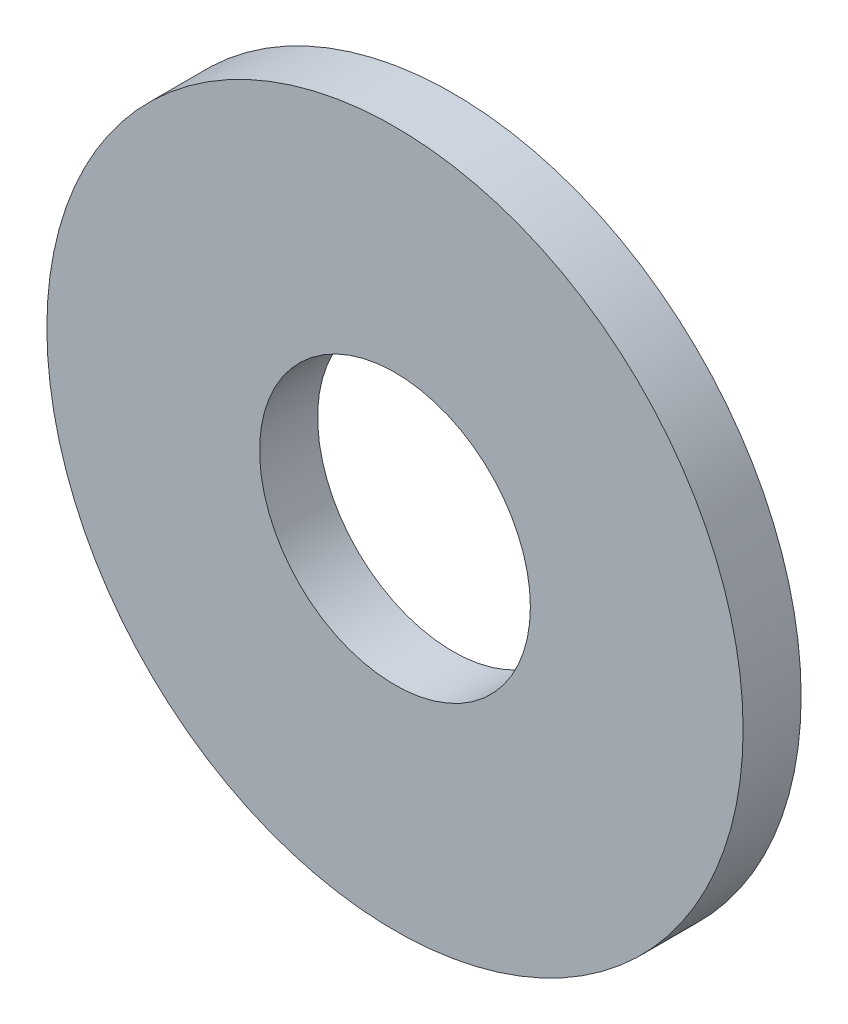
ISO-10303-21;
HEADER;
FILE_DESCRIPTION(('STEP AP214'),'2;1');
FILE_NAME('part.step','',(''),(''),'','','');
FILE_SCHEMA(('AUTOMOTIVE_DESIGN { 1 0 10303 214 1 1 1 1 }'));
ENDSEC;
DATA;
#1=APPLICATION_CONTEXT('core data for automotive mechanical design processes');
#2=APPLICATION_PROTOCOL_DEFINITION('international standard','automotive_design',2000,#1);
#3=PRODUCT_CONTEXT('',#1,'mechanical');
#4=PRODUCT('Part','Part','',(#3));
#5=PRODUCT_RELATED_PRODUCT_CATEGORY('part','',(#4));
#6=PRODUCT_DEFINITION_FORMATION('','',#4);
#7=PRODUCT_DEFINITION_CONTEXT('part definition',#1,'design');
#8=PRODUCT_DEFINITION('design','',#6,#7);
#9=PRODUCT_DEFINITION_SHAPE('','',#8);
#10=(LENGTH_UNIT() NAMED_UNIT(*) SI_UNIT(.MILLI.,.METRE.));
#11=(NAMED_UNIT(*) PLANE_ANGLE_UNIT() SI_UNIT($,.RADIAN.));
#12=(NAMED_UNIT(*) SI_UNIT($,.STERADIAN.) SOLID_ANGLE_UNIT());
#13=UNCERTAINTY_MEASURE_WITH_UNIT(LENGTH_MEASURE(1.E-05),#10,'distance_accuracy_value','');
#14=(GEOMETRIC_REPRESENTATION_CONTEXT(3) GLOBAL_UNCERTAINTY_ASSIGNED_CONTEXT((#13)) GLOBAL_UNIT_ASSIGNED_CONTEXT((#10,
#11,#12)) REPRESENTATION_CONTEXT('',''));
#15=CARTESIAN_POINT('',(0.,0.,0.));
#16=DIRECTION('',(0.,0.,1.));
#17=DIRECTION('',(1.,0.,0.));
#18=AXIS2_PLACEMENT_3D('',#15,#16,#17);
#19=CARTESIAN_POINT('',(0.,0.,1.5));
#20=DIRECTION('',(0.,0.,1.));
#21=DIRECTION('',(1.,0.,0.));
#22=AXIS2_PLACEMENT_3D('',#19,#20,#21);
#23=PLANE('',#22);
#24=CARTESIAN_POINT('',(0.,0.,1.5));
#25=DIRECTION('',(0.,0.,1.));
#26=DIRECTION('',(1.,0.,0.));
#27=AXIS2_PLACEMENT_3D('',#24,#25,#26);
#28=CIRCLE('',#27,9.);
#29=CARTESIAN_POINT('',(9.,0.,1.5));
#30=VERTEX_POINT('',#29);
#31=EDGE_CURVE('E10',#30,#30,#28,.T.);
#32=ORIENTED_EDGE('',*,*,#31,.T.);
#33=EDGE_LOOP('',(#32));
#34=FACE_BOUND('',#33,.T.);
#35=CARTESIAN_POINT('',(0.,0.,1.5));
#36=DIRECTION('',(0.,0.,1.));
#37=DIRECTION('',(1.,0.,0.));
#38=AXIS2_PLACEMENT_3D('',#35,#36,#37);
#39=CIRCLE('',#38,3.5);
#40=CARTESIAN_POINT('',(3.5,0.,1.5));
#41=VERTEX_POINT('',#40);
#42=EDGE_CURVE('E36',#41,#41,#39,.T.);
#43=ORIENTED_EDGE('',*,*,#42,.F.);
#44=EDGE_LOOP('',(#43));
#45=FACE_BOUND('',#44,.T.);
#46=ADVANCED_FACE('F25',(#34,#45),#23,.T.);
#47=CARTESIAN_POINT('',(0.,0.,0.));
#48=DIRECTION('',(0.,0.,1.));
#49=DIRECTION('',(1.,0.,0.));
#50=AXIS2_PLACEMENT_3D('',#47,#48,#49);
#51=PLANE('',#50);
#52=CARTESIAN_POINT('',(0.,0.,0.));
#53=DIRECTION('',(0.,0.,1.));
#54=DIRECTION('',(1.,0.,0.));
#55=AXIS2_PLACEMENT_3D('',#52,#53,#54);
#56=CIRCLE('',#55,9.);
#57=CARTESIAN_POINT('',(9.,0.,0.));
#58=VERTEX_POINT('',#57);
#59=EDGE_CURVE('E32',#58,#58,#56,.T.);
#60=ORIENTED_EDGE('',*,*,#59,.F.);
#61=EDGE_LOOP('',(#60));
#62=FACE_BOUND('',#61,.T.);
#63=CARTESIAN_POINT('',(0.,0.,0.));
#64=DIRECTION('',(0.,0.,1.));
#65=DIRECTION('',(1.,0.,0.));
#66=AXIS2_PLACEMENT_3D('',#63,#64,#65);
#67=CIRCLE('',#66,3.5);
#68=CARTESIAN_POINT('',(3.5,0.,0.));
#69=VERTEX_POINT('',#68);
#70=EDGE_CURVE('E40',#69,#69,#67,.T.);
#71=ORIENTED_EDGE('',*,*,#70,.T.);
#72=EDGE_LOOP('',(#71));
#73=FACE_BOUND('',#72,.T.);
#74=ADVANCED_FACE('F46',(#62,#73),#51,.F.);
#75=CARTESIAN_POINT('',(0.,0.,1.5));
#76=DIRECTION('',(0.,0.,-1.));
#77=DIRECTION('',(-1.,0.,0.));
#78=AXIS2_PLACEMENT_3D('',#75,#76,#77);
#79=CYLINDRICAL_SURFACE('',#78,9.);
#80=ORIENTED_EDGE('',*,*,#31,.F.);
#81=EDGE_LOOP('',(#80));
#82=FACE_BOUND('',#81,.T.);
#83=ORIENTED_EDGE('',*,*,#59,.T.);
#84=EDGE_LOOP('',(#83));
#85=FACE_BOUND('',#84,.T.);
#86=ADVANCED_FACE('F27',(#82,#85),#79,.T.);
#87=CARTESIAN_POINT('',(0.,0.,1.5));
#88=DIRECTION('',(0.,0.,-1.));
#89=DIRECTION('',(-1.,0.,0.));
#90=AXIS2_PLACEMENT_3D('',#87,#88,#89);
#91=CYLINDRICAL_SURFACE('',#90,3.5);
#92=ORIENTED_EDGE('',*,*,#42,.T.);
#93=EDGE_LOOP('',(#92));
#94=FACE_BOUND('',#93,.T.);
#95=ORIENTED_EDGE('',*,*,#70,.F.);
#96=EDGE_LOOP('',(#95));
#97=FACE_BOUND('',#96,.T.);
#98=ADVANCED_FACE('F48',(#94,#97),#91,.F.);
#99=CLOSED_SHELL('',(#46,#74,#86,#98));
#100=MANIFOLD_SOLID_BREP('B2',#99);
#101=ADVANCED_BREP_SHAPE_REPRESENTATION('',(#18,#100),#14);
#102=SHAPE_DEFINITION_REPRESENTATION(#9,#101);
ENDSEC;
END-ISO-10303-21;
